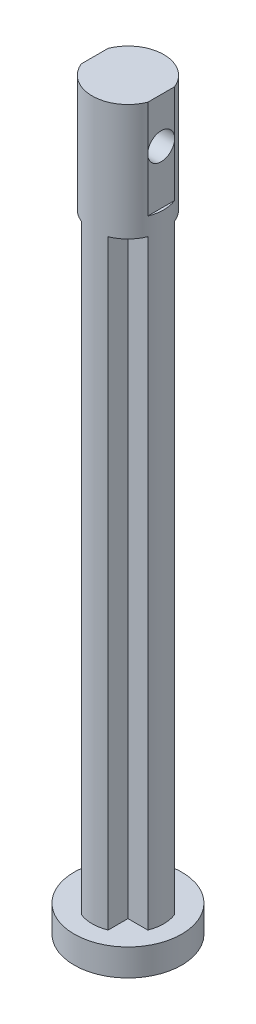
ISO-10303-21;
HEADER;
FILE_DESCRIPTION(('STEP AP214'),'2;1');
FILE_NAME('part.step','',(''),(''),'','','');
FILE_SCHEMA(('AUTOMOTIVE_DESIGN { 1 0 10303 214 1 1 1 1 }'));
ENDSEC;
DATA;
#1=APPLICATION_CONTEXT('core data for automotive mechanical design processes');
#2=APPLICATION_PROTOCOL_DEFINITION('international standard','automotive_design',2000,#1);
#3=PRODUCT_CONTEXT('',#1,'mechanical');
#4=PRODUCT('Part','Part','',(#3));
#5=PRODUCT_RELATED_PRODUCT_CATEGORY('part','',(#4));
#6=PRODUCT_DEFINITION_FORMATION('','',#4);
#7=PRODUCT_DEFINITION_CONTEXT('part definition',#1,'design');
#8=PRODUCT_DEFINITION('design','',#6,#7);
#9=PRODUCT_DEFINITION_SHAPE('','',#8);
#10=(LENGTH_UNIT() NAMED_UNIT(*) SI_UNIT(.MILLI.,.METRE.));
#11=(NAMED_UNIT(*) PLANE_ANGLE_UNIT() SI_UNIT($,.RADIAN.));
#12=(NAMED_UNIT(*) SI_UNIT($,.STERADIAN.) SOLID_ANGLE_UNIT());
#13=UNCERTAINTY_MEASURE_WITH_UNIT(LENGTH_MEASURE(1.E-05),#10,'distance_accuracy_value','');
#14=(GEOMETRIC_REPRESENTATION_CONTEXT(3) GLOBAL_UNCERTAINTY_ASSIGNED_CONTEXT((#13)) GLOBAL_UNIT_ASSIGNED_CONTEXT((#10,
#11,#12)) REPRESENTATION_CONTEXT('',''));
#15=CARTESIAN_POINT('',(0.,0.,0.));
#16=DIRECTION('',(0.,0.,1.));
#17=DIRECTION('',(1.,0.,0.));
#18=AXIS2_PLACEMENT_3D('',#15,#16,#17);
#19=CARTESIAN_POINT('',(-3.70809924354783,2.,-1.5));
#20=DIRECTION('',(-1.,0.,0.));
#21=DIRECTION('',(0.,0.,1.));
#22=AXIS2_PLACEMENT_3D('',#19,#20,#21);
#23=PLANE('',#22);
#24=DIRECTION('',(0.,1.,0.));
#25=VECTOR('',#24,1.);
#26=CARTESIAN_POINT('',(-3.70809924354783,2.,-1.5));
#27=LINE('',#26,#25);
#28=CARTESIAN_POINT('',(-3.70809924354783,8.,-1.5));
#29=VERTEX_POINT('',#28);
#30=CARTESIAN_POINT('',(-3.70809924354783,13.,-1.5));
#31=VERTEX_POINT('',#30);
#32=EDGE_CURVE('E177',#29,#31,#27,.T.);
#33=ORIENTED_EDGE('',*,*,#32,.F.);
#34=CARTESIAN_POINT('',(-3.70809924354783,8.,0.));
#35=DIRECTION('',(1.,0.,0.));
#36=DIRECTION('',(0.,0.,-1.));
#37=AXIS2_PLACEMENT_3D('',#34,#35,#36);
#38=CIRCLE('',#37,1.5);
#39=CARTESIAN_POINT('',(-3.70809924354783,8.,1.5));
#40=VERTEX_POINT('',#39);
#41=EDGE_CURVE('E60',#29,#40,#38,.T.);
#42=ORIENTED_EDGE('',*,*,#41,.T.);
#43=DIRECTION('',(0.,1.,0.));
#44=VECTOR('',#43,1.);
#45=CARTESIAN_POINT('',(-3.70809924354783,2.,1.5));
#46=LINE('',#45,#44);
#47=CARTESIAN_POINT('',(-3.70809924354783,13.,1.5));
#48=VERTEX_POINT('',#47);
#49=EDGE_CURVE('E171',#40,#48,#46,.T.);
#50=ORIENTED_EDGE('',*,*,#49,.T.);
#51=DIRECTION('',(0.,0.,1.));
#52=VECTOR('',#51,1.);
#53=CARTESIAN_POINT('',(-3.70809924354783,13.,-1.5));
#54=LINE('',#53,#52);
#55=EDGE_CURVE('E180',#31,#48,#54,.T.);
#56=ORIENTED_EDGE('',*,*,#55,.F.);
#57=EDGE_LOOP('',(#33,#42,#50,#56));
#58=FACE_BOUND('',#57,.T.);
#59=ADVANCED_FACE('F41',(#58),#23,.T.);
#60=CARTESIAN_POINT('',(0.,13.,0.));
#61=DIRECTION('',(0.,1.,0.));
#62=DIRECTION('',(0.,0.,1.));
#63=AXIS2_PLACEMENT_3D('',#60,#61,#62);
#64=PLANE('',#63);
#65=CARTESIAN_POINT('',(0.,13.,0.));
#66=DIRECTION('',(0.,1.,0.));
#67=DIRECTION('',(0.,0.,1.));
#68=AXIS2_PLACEMENT_3D('',#65,#66,#67);
#69=CIRCLE('',#68,4.);
#70=CARTESIAN_POINT('',(3.70809924354783,13.,-1.5));
#71=VERTEX_POINT('',#70);
#72=EDGE_CURVE('E217',#71,#31,#69,.T.);
#73=ORIENTED_EDGE('',*,*,#72,.T.);
#74=ORIENTED_EDGE('',*,*,#55,.T.);
#75=CARTESIAN_POINT('',(3.70809924354783,13.,1.5));
#76=VERTEX_POINT('',#75);
#77=EDGE_CURVE('E183',#48,#76,#69,.T.);
#78=ORIENTED_EDGE('',*,*,#77,.T.);
#79=DIRECTION('',(0.,0.,1.));
#80=VECTOR('',#79,1.);
#81=CARTESIAN_POINT('',(3.70809924354783,13.,-1.5));
#82=LINE('',#81,#80);
#83=EDGE_CURVE('E191',#71,#76,#82,.T.);
#84=ORIENTED_EDGE('',*,*,#83,.F.);
#85=EDGE_LOOP('',(#73,#74,#78,#84));
#86=FACE_BOUND('',#85,.T.);
#87=ADVANCED_FACE('F356',(#86),#64,.T.);
#88=CARTESIAN_POINT('',(0.,-67.,0.));
#89=DIRECTION('',(0.,1.,0.));
#90=DIRECTION('',(0.,0.,1.));
#91=AXIS2_PLACEMENT_3D('',#88,#89,#90);
#92=CYLINDRICAL_SURFACE('',#91,4.);
#93=DIRECTION('',(0.,1.,0.));
#94=VECTOR('',#93,1.);
#95=CARTESIAN_POINT('',(1.50000000000009,-67.,3.70809924354792));
#96=LINE('',#95,#94);
#97=CARTESIAN_POINT('',(1.50000000000009,-67.,3.70809924354792));
#98=VERTEX_POINT('',#97);
#99=CARTESIAN_POINT('',(1.50000000000009,0.,3.70809924354792));
#100=VERTEX_POINT('',#99);
#101=EDGE_CURVE('E49',#98,#100,#96,.T.);
#102=ORIENTED_EDGE('',*,*,#101,.T.);
#103=CARTESIAN_POINT('',(0.,0.,0.));
#104=DIRECTION('',(0.,1.,0.));
#105=DIRECTION('',(0.,0.,1.));
#106=AXIS2_PLACEMENT_3D('',#103,#104,#105);
#107=CIRCLE('',#106,4.);
#108=CARTESIAN_POINT('',(3.70809924354783,0.,1.50000000000001));
#109=VERTEX_POINT('',#108);
#110=EDGE_CURVE('E225',#100,#109,#107,.T.);
#111=ORIENTED_EDGE('',*,*,#110,.T.);
#112=DIRECTION('',(0.,1.,0.));
#113=VECTOR('',#112,1.);
#114=CARTESIAN_POINT('',(3.70809924354783,-67.,1.50000000000001));
#115=LINE('',#114,#113);
#116=CARTESIAN_POINT('',(3.70809924354783,-67.,1.50000000000001));
#117=VERTEX_POINT('',#116);
#118=EDGE_CURVE('E44',#117,#109,#115,.T.);
#119=ORIENTED_EDGE('',*,*,#118,.F.);
#120=CARTESIAN_POINT('',(0.,-67.,0.));
#121=DIRECTION('',(0.,1.,0.));
#122=DIRECTION('',(0.,0.,1.));
#123=AXIS2_PLACEMENT_3D('',#120,#121,#122);
#124=CIRCLE('',#123,4.);
#125=CARTESIAN_POINT('',(3.70809924354784,-67.,-1.49999999999999));
#126=VERTEX_POINT('',#125);
#127=EDGE_CURVE('E229',#117,#126,#124,.T.);
#128=ORIENTED_EDGE('',*,*,#127,.T.);
#129=DIRECTION('',(0.,1.,0.));
#130=VECTOR('',#129,1.);
#131=CARTESIAN_POINT('',(3.70809924354784,-67.,-1.49999999999999));
#132=LINE('',#131,#130);
#133=CARTESIAN_POINT('',(3.70809924354784,0.,-1.49999999999999));
#134=VERTEX_POINT('',#133);
#135=EDGE_CURVE('E286',#126,#134,#132,.T.);
#136=ORIENTED_EDGE('',*,*,#135,.T.);
#137=CARTESIAN_POINT('',(1.5,0.,-3.70809924354783));
#138=VERTEX_POINT('',#137);
#139=EDGE_CURVE('E223',#134,#138,#107,.T.);
#140=ORIENTED_EDGE('',*,*,#139,.T.);
#141=DIRECTION('',(0.,1.,0.));
#142=VECTOR('',#141,1.);
#143=CARTESIAN_POINT('',(1.5,-67.,-3.70809924354783));
#144=LINE('',#143,#142);
#145=CARTESIAN_POINT('',(1.5,-67.,-3.70809924354783));
#146=VERTEX_POINT('',#145);
#147=EDGE_CURVE('E290',#146,#138,#144,.T.);
#148=ORIENTED_EDGE('',*,*,#147,.F.);
#149=CARTESIAN_POINT('',(-1.5,-67.,-3.70809924354783));
#150=VERTEX_POINT('',#149);
#151=EDGE_CURVE('E234',#146,#150,#124,.T.);
#152=ORIENTED_EDGE('',*,*,#151,.T.);
#153=DIRECTION('',(0.,1.,0.));
#154=VECTOR('',#153,1.);
#155=CARTESIAN_POINT('',(-1.5,-67.,-3.70809924354783));
#156=LINE('',#155,#154);
#157=CARTESIAN_POINT('',(-1.5,0.,-3.70809924354783));
#158=VERTEX_POINT('',#157);
#159=EDGE_CURVE('E283',#150,#158,#156,.T.);
#160=ORIENTED_EDGE('',*,*,#159,.T.);
#161=CARTESIAN_POINT('',(-3.70809924354782,0.,-1.50000000000004));
#162=VERTEX_POINT('',#161);
#163=EDGE_CURVE('E319',#158,#162,#107,.T.);
#164=ORIENTED_EDGE('',*,*,#163,.T.);
#165=DIRECTION('',(0.,1.,0.));
#166=VECTOR('',#165,1.);
#167=CARTESIAN_POINT('',(-3.70809924354782,-67.,-1.50000000000004));
#168=LINE('',#167,#166);
#169=CARTESIAN_POINT('',(-3.70809924354782,-67.,-1.50000000000004));
#170=VERTEX_POINT('',#169);
#171=EDGE_CURVE('E282',#170,#162,#168,.T.);
#172=ORIENTED_EDGE('',*,*,#171,.F.);
#173=CARTESIAN_POINT('',(-3.70809924354785,-67.,1.49999999999996));
#174=VERTEX_POINT('',#173);
#175=EDGE_CURVE('E241',#170,#174,#124,.T.);
#176=ORIENTED_EDGE('',*,*,#175,.T.);
#177=DIRECTION('',(0.,1.,0.));
#178=VECTOR('',#177,1.);
#179=CARTESIAN_POINT('',(-3.70809924354785,-67.,1.49999999999996));
#180=LINE('',#179,#178);
#181=CARTESIAN_POINT('',(-3.70809924354785,0.,1.49999999999996));
#182=VERTEX_POINT('',#181);
#183=EDGE_CURVE('E276',#174,#182,#180,.T.);
#184=ORIENTED_EDGE('',*,*,#183,.T.);
#185=CARTESIAN_POINT('',(-1.49999999999991,0.,3.70809924354792));
#186=VERTEX_POINT('',#185);
#187=EDGE_CURVE('E214',#182,#186,#107,.T.);
#188=ORIENTED_EDGE('',*,*,#187,.T.);
#189=DIRECTION('',(0.,1.,0.));
#190=VECTOR('',#189,1.);
#191=CARTESIAN_POINT('',(-1.49999999999991,-67.,3.70809924354792));
#192=LINE('',#191,#190);
#193=CARTESIAN_POINT('',(-1.49999999999991,-67.,3.70809924354792));
#194=VERTEX_POINT('',#193);
#195=EDGE_CURVE('E274',#194,#186,#192,.T.);
#196=ORIENTED_EDGE('',*,*,#195,.F.);
#197=EDGE_CURVE('E233',#194,#98,#124,.T.);
#198=ORIENTED_EDGE('',*,*,#197,.T.);
#199=EDGE_LOOP('',(#102,#111,#119,#128,#136,#140,#148,#152,#160,#164,#172,#176,#184,#188,#196,#198));
#200=FACE_BOUND('',#199,.T.);
#201=CARTESIAN_POINT('',(0.,2.,0.));
#202=DIRECTION('',(0.,-1.,0.));
#203=DIRECTION('',(0.,0.,1.));
#204=AXIS2_PLACEMENT_3D('',#201,#202,#203);
#205=CIRCLE('',#204,4.);
#206=CARTESIAN_POINT('',(-3.70809924354783,2.,1.5));
#207=VERTEX_POINT('',#206);
#208=CARTESIAN_POINT('',(-3.70809924354783,2.,-1.5));
#209=VERTEX_POINT('',#208);
#210=EDGE_CURVE('E567',#207,#209,#205,.T.);
#211=ORIENTED_EDGE('',*,*,#210,.T.);
#212=EDGE_CURVE('E61',#209,#29,#27,.T.);
#213=ORIENTED_EDGE('',*,*,#212,.T.);
#214=ORIENTED_EDGE('',*,*,#32,.T.);
#215=ORIENTED_EDGE('',*,*,#72,.F.);
#216=DIRECTION('',(0.,1.,0.));
#217=VECTOR('',#216,1.);
#218=CARTESIAN_POINT('',(3.70809924354783,2.,-1.5));
#219=LINE('',#218,#217);
#220=CARTESIAN_POINT('',(3.70809924354783,8.,-1.5));
#221=VERTEX_POINT('',#220);
#222=EDGE_CURVE('E203',#221,#71,#219,.T.);
#223=ORIENTED_EDGE('',*,*,#222,.F.);
#224=CARTESIAN_POINT('',(3.70809924354783,2.,-1.5));
#225=VERTEX_POINT('',#224);
#226=EDGE_CURVE('E207',#225,#221,#219,.T.);
#227=ORIENTED_EDGE('',*,*,#226,.F.);
#228=CARTESIAN_POINT('',(0.,2.,0.));
#229=DIRECTION('',(0.,1.,0.));
#230=DIRECTION('',(0.,0.,1.));
#231=AXIS2_PLACEMENT_3D('',#228,#229,#230);
#232=CIRCLE('',#231,4.);
#233=CARTESIAN_POINT('',(3.70809924354783,2.,1.5));
#234=VERTEX_POINT('',#233);
#235=EDGE_CURVE('E197',#234,#225,#232,.T.);
#236=ORIENTED_EDGE('',*,*,#235,.F.);
#237=DIRECTION('',(0.,1.,0.));
#238=VECTOR('',#237,1.);
#239=CARTESIAN_POINT('',(3.70809924354783,2.,1.5));
#240=LINE('',#239,#238);
#241=CARTESIAN_POINT('',(3.70809924354783,8.,1.5));
#242=VERTEX_POINT('',#241);
#243=EDGE_CURVE('E204',#234,#242,#240,.T.);
#244=ORIENTED_EDGE('',*,*,#243,.T.);
#245=EDGE_CURVE('E208',#242,#76,#240,.T.);
#246=ORIENTED_EDGE('',*,*,#245,.T.);
#247=ORIENTED_EDGE('',*,*,#77,.F.);
#248=ORIENTED_EDGE('',*,*,#49,.F.);
#249=EDGE_CURVE('E181',#207,#40,#46,.T.);
#250=ORIENTED_EDGE('',*,*,#249,.F.);
#251=EDGE_LOOP('',(#211,#213,#214,#215,#223,#227,#236,#244,#246,#247,#248,#250));
#252=FACE_BOUND('',#251,.T.);
#253=ADVANCED_FACE('F185',(#200,#252),#92,.T.);
#254=CARTESIAN_POINT('',(3.70809924354783,2.,-1.5));
#255=DIRECTION('',(-1.,0.,0.));
#256=DIRECTION('',(0.,0.,1.));
#257=AXIS2_PLACEMENT_3D('',#254,#255,#256);
#258=PLANE('',#257);
#259=CARTESIAN_POINT('',(3.70809924354783,8.,0.));
#260=DIRECTION('',(1.,0.,0.));
#261=DIRECTION('',(0.,0.,-1.));
#262=AXIS2_PLACEMENT_3D('',#259,#260,#261);
#263=CIRCLE('',#262,1.5);
#264=EDGE_CURVE('E193',#221,#242,#263,.T.);
#265=ORIENTED_EDGE('',*,*,#264,.F.);
#266=ORIENTED_EDGE('',*,*,#222,.T.);
#267=ORIENTED_EDGE('',*,*,#83,.T.);
#268=ORIENTED_EDGE('',*,*,#245,.F.);
#269=EDGE_LOOP('',(#265,#266,#267,#268));
#270=FACE_BOUND('',#269,.T.);
#271=ADVANCED_FACE('F386',(#270),#258,.F.);
#272=CARTESIAN_POINT('',(0.,-67.,1.5));
#273=DIRECTION('',(0.,0.,-1.));
#274=DIRECTION('',(-1.,0.,0.));
#275=AXIS2_PLACEMENT_3D('',#272,#273,#274);
#276=PLANE('',#275);
#277=DIRECTION('',(-1.,0.,0.));
#278=VECTOR('',#277,1.);
#279=CARTESIAN_POINT('',(0.,0.,1.5));
#280=LINE('',#279,#278);
#281=CARTESIAN_POINT('',(1.49999999999999,0.,1.50000000000001));
#282=VERTEX_POINT('',#281);
#283=EDGE_CURVE('E222',#109,#282,#280,.T.);
#284=ORIENTED_EDGE('',*,*,#283,.T.);
#285=DIRECTION('',(0.,1.,0.));
#286=VECTOR('',#285,1.);
#287=CARTESIAN_POINT('',(1.49999999999999,-67.,1.50000000000001));
#288=LINE('',#287,#286);
#289=CARTESIAN_POINT('',(1.49999999999999,-67.,1.50000000000001));
#290=VERTEX_POINT('',#289);
#291=EDGE_CURVE('E11',#290,#282,#288,.T.);
#292=ORIENTED_EDGE('',*,*,#291,.F.);
#293=DIRECTION('',(-1.,0.,0.));
#294=VECTOR('',#293,1.);
#295=CARTESIAN_POINT('',(0.,-67.,1.5));
#296=LINE('',#295,#294);
#297=EDGE_CURVE('E227',#117,#290,#296,.T.);
#298=ORIENTED_EDGE('',*,*,#297,.F.);
#299=ORIENTED_EDGE('',*,*,#118,.T.);
#300=EDGE_LOOP('',(#284,#292,#298,#299));
#301=FACE_BOUND('',#300,.T.);
#302=ADVANCED_FACE('F43',(#301),#276,.F.);
#303=CARTESIAN_POINT('',(1.49999999999993,-67.,0.));
#304=DIRECTION('',(1.,0.,0.));
#305=DIRECTION('',(0.,0.,-1.));
#306=AXIS2_PLACEMENT_3D('',#303,#304,#305);
#307=PLANE('',#306);
#308=DIRECTION('',(0.,0.,-1.));
#309=VECTOR('',#308,1.);
#310=CARTESIAN_POINT('',(1.49999999999993,0.,0.));
#311=LINE('',#310,#309);
#312=EDGE_CURVE('E226',#100,#282,#311,.T.);
#313=ORIENTED_EDGE('',*,*,#312,.F.);
#314=ORIENTED_EDGE('',*,*,#101,.F.);
#315=DIRECTION('',(0.,0.,-1.));
#316=VECTOR('',#315,1.);
#317=CARTESIAN_POINT('',(1.49999999999993,-67.,0.));
#318=LINE('',#317,#316);
#319=EDGE_CURVE('E246',#98,#290,#318,.T.);
#320=ORIENTED_EDGE('',*,*,#319,.T.);
#321=ORIENTED_EDGE('',*,*,#291,.T.);
#322=EDGE_LOOP('',(#313,#314,#320,#321));
#323=FACE_BOUND('',#322,.T.);
#324=ADVANCED_FACE('F306',(#323),#307,.T.);
#325=CARTESIAN_POINT('',(-1.49999999999992,-67.,0.));
#326=DIRECTION('',(1.,0.,0.));
#327=DIRECTION('',(0.,0.,-1.));
#328=AXIS2_PLACEMENT_3D('',#325,#326,#327);
#329=PLANE('',#328);
#330=DIRECTION('',(0.,0.,-1.));
#331=VECTOR('',#330,1.);
#332=CARTESIAN_POINT('',(-1.49999999999992,0.,0.));
#333=LINE('',#332,#331);
#334=CARTESIAN_POINT('',(-1.49999999999992,0.,1.50000000000009));
#335=VERTEX_POINT('',#334);
#336=EDGE_CURVE('E267',#186,#335,#333,.T.);
#337=ORIENTED_EDGE('',*,*,#336,.T.);
#338=DIRECTION('',(0.,1.,0.));
#339=VECTOR('',#338,1.);
#340=CARTESIAN_POINT('',(-1.49999999999992,-67.,1.50000000000009));
#341=LINE('',#340,#339);
#342=CARTESIAN_POINT('',(-1.49999999999992,-67.,1.50000000000009));
#343=VERTEX_POINT('',#342);
#344=EDGE_CURVE('E280',#343,#335,#341,.T.);
#345=ORIENTED_EDGE('',*,*,#344,.F.);
#346=DIRECTION('',(0.,0.,-1.));
#347=VECTOR('',#346,1.);
#348=CARTESIAN_POINT('',(-1.49999999999992,-67.,0.));
#349=LINE('',#348,#347);
#350=EDGE_CURVE('E248',#194,#343,#349,.T.);
#351=ORIENTED_EDGE('',*,*,#350,.F.);
#352=ORIENTED_EDGE('',*,*,#195,.T.);
#353=EDGE_LOOP('',(#337,#345,#351,#352));
#354=FACE_BOUND('',#353,.T.);
#355=ADVANCED_FACE('F333',(#354),#329,.F.);
#356=CARTESIAN_POINT('',(0.,-67.,1.50000000000017));
#357=DIRECTION('',(0.,0.,1.));
#358=DIRECTION('',(1.,0.,0.));
#359=AXIS2_PLACEMENT_3D('',#356,#357,#358);
#360=PLANE('',#359);
#361=DIRECTION('',(1.,0.,0.));
#362=VECTOR('',#361,1.);
#363=CARTESIAN_POINT('',(0.,0.,1.50000000000017));
#364=LINE('',#363,#362);
#365=EDGE_CURVE('E266',#182,#335,#364,.T.);
#366=ORIENTED_EDGE('',*,*,#365,.F.);
#367=ORIENTED_EDGE('',*,*,#183,.F.);
#368=DIRECTION('',(1.,0.,0.));
#369=VECTOR('',#368,1.);
#370=CARTESIAN_POINT('',(0.,-67.,1.50000000000017));
#371=LINE('',#370,#369);
#372=EDGE_CURVE('E243',#174,#343,#371,.T.);
#373=ORIENTED_EDGE('',*,*,#372,.T.);
#374=ORIENTED_EDGE('',*,*,#344,.T.);
#375=EDGE_LOOP('',(#366,#367,#373,#374));
#376=FACE_BOUND('',#375,.T.);
#377=ADVANCED_FACE('F340',(#376),#360,.T.);
#378=CARTESIAN_POINT('',(0.,-67.,-1.49999999999997));
#379=DIRECTION('',(0.,0.,1.));
#380=DIRECTION('',(1.,0.,0.));
#381=AXIS2_PLACEMENT_3D('',#378,#379,#380);
#382=PLANE('',#381);
#383=DIRECTION('',(1.,0.,0.));
#384=VECTOR('',#383,1.);
#385=CARTESIAN_POINT('',(0.,0.,-1.49999999999997));
#386=LINE('',#385,#384);
#387=CARTESIAN_POINT('',(-1.5,0.,-1.5));
#388=VERTEX_POINT('',#387);
#389=EDGE_CURVE('E263',#162,#388,#386,.T.);
#390=ORIENTED_EDGE('',*,*,#389,.T.);
#391=DIRECTION('',(0.,1.,0.));
#392=VECTOR('',#391,1.);
#393=CARTESIAN_POINT('',(-1.5,-67.,-1.5));
#394=LINE('',#393,#392);
#395=CARTESIAN_POINT('',(-1.5,-67.,-1.5));
#396=VERTEX_POINT('',#395);
#397=EDGE_CURVE('E284',#396,#388,#394,.T.);
#398=ORIENTED_EDGE('',*,*,#397,.F.);
#399=DIRECTION('',(1.,0.,0.));
#400=VECTOR('',#399,1.);
#401=CARTESIAN_POINT('',(0.,-67.,-1.49999999999997));
#402=LINE('',#401,#400);
#403=EDGE_CURVE('E245',#170,#396,#402,.T.);
#404=ORIENTED_EDGE('',*,*,#403,.F.);
#405=ORIENTED_EDGE('',*,*,#171,.T.);
#406=EDGE_LOOP('',(#390,#398,#404,#405));
#407=FACE_BOUND('',#406,.T.);
#408=ADVANCED_FACE('F349',(#407),#382,.F.);
#409=CARTESIAN_POINT('',(-1.5,-67.,0.));
#410=DIRECTION('',(-1.,0.,0.));
#411=DIRECTION('',(0.,0.,1.));
#412=AXIS2_PLACEMENT_3D('',#409,#410,#411);
#413=PLANE('',#412);
#414=DIRECTION('',(0.,0.,1.));
#415=VECTOR('',#414,1.);
#416=CARTESIAN_POINT('',(-1.5,0.,0.));
#417=LINE('',#416,#415);
#418=EDGE_CURVE('E257',#158,#388,#417,.T.);
#419=ORIENTED_EDGE('',*,*,#418,.F.);
#420=ORIENTED_EDGE('',*,*,#159,.F.);
#421=DIRECTION('',(0.,0.,1.));
#422=VECTOR('',#421,1.);
#423=CARTESIAN_POINT('',(-1.5,-67.,0.));
#424=LINE('',#423,#422);
#425=EDGE_CURVE('E239',#150,#396,#424,.T.);
#426=ORIENTED_EDGE('',*,*,#425,.T.);
#427=ORIENTED_EDGE('',*,*,#397,.T.);
#428=EDGE_LOOP('',(#419,#420,#426,#427));
#429=FACE_BOUND('',#428,.T.);
#430=ADVANCED_FACE('F344',(#429),#413,.T.);
#431=CARTESIAN_POINT('',(1.5,-67.,0.));
#432=DIRECTION('',(-1.,0.,0.));
#433=DIRECTION('',(0.,0.,1.));
#434=AXIS2_PLACEMENT_3D('',#431,#432,#433);
#435=PLANE('',#434);
#436=DIRECTION('',(0.,0.,1.));
#437=VECTOR('',#436,1.);
#438=CARTESIAN_POINT('',(1.5,0.,0.));
#439=LINE('',#438,#437);
#440=CARTESIAN_POINT('',(1.5,0.,-1.5));
#441=VERTEX_POINT('',#440);
#442=EDGE_CURVE('E260',#138,#441,#439,.T.);
#443=ORIENTED_EDGE('',*,*,#442,.T.);
#444=DIRECTION('',(0.,1.,0.));
#445=VECTOR('',#444,1.);
#446=CARTESIAN_POINT('',(1.5,-67.,-1.5));
#447=LINE('',#446,#445);
#448=CARTESIAN_POINT('',(1.5,-67.,-1.5));
#449=VERTEX_POINT('',#448);
#450=EDGE_CURVE('E289',#449,#441,#447,.T.);
#451=ORIENTED_EDGE('',*,*,#450,.F.);
#452=DIRECTION('',(0.,0.,1.));
#453=VECTOR('',#452,1.);
#454=CARTESIAN_POINT('',(1.5,-67.,0.));
#455=LINE('',#454,#453);
#456=EDGE_CURVE('E240',#146,#449,#455,.T.);
#457=ORIENTED_EDGE('',*,*,#456,.F.);
#458=ORIENTED_EDGE('',*,*,#147,.T.);
#459=EDGE_LOOP('',(#443,#451,#457,#458));
#460=FACE_BOUND('',#459,.T.);
#461=ADVANCED_FACE('F357',(#460),#435,.F.);
#462=CARTESIAN_POINT('',(0.,-67.,-1.50000000000001));
#463=DIRECTION('',(0.,0.,-1.));
#464=DIRECTION('',(-1.,0.,0.));
#465=AXIS2_PLACEMENT_3D('',#462,#463,#464);
#466=PLANE('',#465);
#467=DIRECTION('',(-1.,0.,0.));
#468=VECTOR('',#467,1.);
#469=CARTESIAN_POINT('',(0.,0.,-1.50000000000001));
#470=LINE('',#469,#468);
#471=EDGE_CURVE('E255',#134,#441,#470,.T.);
#472=ORIENTED_EDGE('',*,*,#471,.F.);
#473=ORIENTED_EDGE('',*,*,#135,.F.);
#474=DIRECTION('',(-1.,0.,0.));
#475=VECTOR('',#474,1.);
#476=CARTESIAN_POINT('',(0.,-67.,-1.50000000000001));
#477=LINE('',#476,#475);
#478=EDGE_CURVE('E235',#126,#449,#477,.T.);
#479=ORIENTED_EDGE('',*,*,#478,.T.);
#480=ORIENTED_EDGE('',*,*,#450,.T.);
#481=EDGE_LOOP('',(#472,#473,#479,#480));
#482=FACE_BOUND('',#481,.T.);
#483=ADVANCED_FACE('F314',(#482),#466,.T.);
#484=CARTESIAN_POINT('',(0.,0.,0.));
#485=DIRECTION('',(0.,1.,0.));
#486=DIRECTION('',(0.,0.,1.));
#487=AXIS2_PLACEMENT_3D('',#484,#485,#486);
#488=PLANE('',#487);
#489=ORIENTED_EDGE('',*,*,#139,.F.);
#490=ORIENTED_EDGE('',*,*,#471,.T.);
#491=ORIENTED_EDGE('',*,*,#442,.F.);
#492=EDGE_LOOP('',(#489,#490,#491));
#493=FACE_BOUND('',#492,.T.);
#494=ADVANCED_FACE('F318',(#493),#488,.F.);
#495=ORIENTED_EDGE('',*,*,#163,.F.);
#496=ORIENTED_EDGE('',*,*,#418,.T.);
#497=ORIENTED_EDGE('',*,*,#389,.F.);
#498=EDGE_LOOP('',(#495,#496,#497));
#499=FACE_BOUND('',#498,.T.);
#500=ADVANCED_FACE('F350',(#499),#488,.F.);
#501=ORIENTED_EDGE('',*,*,#187,.F.);
#502=ORIENTED_EDGE('',*,*,#365,.T.);
#503=ORIENTED_EDGE('',*,*,#336,.F.);
#504=EDGE_LOOP('',(#501,#502,#503));
#505=FACE_BOUND('',#504,.T.);
#506=ADVANCED_FACE('F335',(#505),#488,.F.);
#507=ORIENTED_EDGE('',*,*,#283,.F.);
#508=ORIENTED_EDGE('',*,*,#110,.F.);
#509=ORIENTED_EDGE('',*,*,#312,.T.);
#510=EDGE_LOOP('',(#507,#508,#509));
#511=FACE_BOUND('',#510,.T.);
#512=ADVANCED_FACE('F305',(#511),#488,.F.);
#513=CARTESIAN_POINT('',(0.,-67.,0.));
#514=DIRECTION('',(0.,1.,0.));
#515=DIRECTION('',(0.,0.,1.));
#516=AXIS2_PLACEMENT_3D('',#513,#514,#515);
#517=PLANE('',#516);
#518=CARTESIAN_POINT('',(0.,-67.,0.));
#519=DIRECTION('',(0.,1.,0.));
#520=DIRECTION('',(0.,0.,1.));
#521=AXIS2_PLACEMENT_3D('',#518,#519,#520);
#522=CIRCLE('',#521,6.);
#523=CARTESIAN_POINT('',(0.,-67.,6.));
#524=VERTEX_POINT('',#523);
#525=EDGE_CURVE('E210',#524,#524,#522,.T.);
#526=ORIENTED_EDGE('',*,*,#525,.T.);
#527=EDGE_LOOP('',(#526));
#528=FACE_BOUND('',#527,.T.);
#529=ORIENTED_EDGE('',*,*,#127,.F.);
#530=ORIENTED_EDGE('',*,*,#297,.T.);
#531=ORIENTED_EDGE('',*,*,#319,.F.);
#532=ORIENTED_EDGE('',*,*,#197,.F.);
#533=ORIENTED_EDGE('',*,*,#350,.T.);
#534=ORIENTED_EDGE('',*,*,#372,.F.);
#535=ORIENTED_EDGE('',*,*,#175,.F.);
#536=ORIENTED_EDGE('',*,*,#403,.T.);
#537=ORIENTED_EDGE('',*,*,#425,.F.);
#538=ORIENTED_EDGE('',*,*,#151,.F.);
#539=ORIENTED_EDGE('',*,*,#456,.T.);
#540=ORIENTED_EDGE('',*,*,#478,.F.);
#541=EDGE_LOOP('',(#529,#530,#531,#532,#533,#534,#535,#536,#537,#538,#539,#540));
#542=FACE_BOUND('',#541,.T.);
#543=ADVANCED_FACE('F309',(#528,#542),#517,.T.);
#544=CARTESIAN_POINT('',(0.,-70.,0.));
#545=DIRECTION('',(0.,1.,0.));
#546=DIRECTION('',(0.,0.,1.));
#547=AXIS2_PLACEMENT_3D('',#544,#545,#546);
#548=CYLINDRICAL_SURFACE('',#547,6.);
#549=CARTESIAN_POINT('',(0.,-70.,0.));
#550=DIRECTION('',(0.,1.,0.));
#551=DIRECTION('',(0.,0.,1.));
#552=AXIS2_PLACEMENT_3D('',#549,#550,#551);
#553=CIRCLE('',#552,6.);
#554=CARTESIAN_POINT('',(0.,-70.,6.));
#555=VERTEX_POINT('',#554);
#556=EDGE_CURVE('E215',#555,#555,#553,.T.);
#557=ORIENTED_EDGE('',*,*,#556,.T.);
#558=EDGE_LOOP('',(#557));
#559=FACE_BOUND('',#558,.T.);
#560=ORIENTED_EDGE('',*,*,#525,.F.);
#561=EDGE_LOOP('',(#560));
#562=FACE_BOUND('',#561,.T.);
#563=ADVANCED_FACE('F395',(#559,#562),#548,.T.);
#564=CARTESIAN_POINT('',(0.,-70.,0.));
#565=DIRECTION('',(0.,1.,0.));
#566=DIRECTION('',(0.,0.,1.));
#567=AXIS2_PLACEMENT_3D('',#564,#565,#566);
#568=PLANE('',#567);
#569=ORIENTED_EDGE('',*,*,#556,.F.);
#570=EDGE_LOOP('',(#569));
#571=FACE_BOUND('',#570,.T.);
#572=ADVANCED_FACE('F390',(#571),#568,.F.);
#573=EDGE_CURVE('E198',#242,#221,#263,.T.);
#574=ORIENTED_EDGE('',*,*,#573,.F.);
#575=ORIENTED_EDGE('',*,*,#243,.F.);
#576=DIRECTION('',(0.,0.,1.));
#577=VECTOR('',#576,1.);
#578=CARTESIAN_POINT('',(3.70809924354783,2.,-1.5));
#579=LINE('',#578,#577);
#580=EDGE_CURVE('E200',#225,#234,#579,.T.);
#581=ORIENTED_EDGE('',*,*,#580,.F.);
#582=ORIENTED_EDGE('',*,*,#226,.T.);
#583=EDGE_LOOP('',(#574,#575,#581,#582));
#584=FACE_BOUND('',#583,.T.);
#585=ADVANCED_FACE('F385',(#584),#258,.F.);
#586=CARTESIAN_POINT('',(0.,2.,0.));
#587=DIRECTION('',(0.,1.,0.));
#588=DIRECTION('',(0.,0.,1.));
#589=AXIS2_PLACEMENT_3D('',#586,#587,#588);
#590=PLANE('',#589);
#591=ORIENTED_EDGE('',*,*,#235,.T.);
#592=ORIENTED_EDGE('',*,*,#580,.T.);
#593=EDGE_LOOP('',(#591,#592));
#594=FACE_BOUND('',#593,.T.);
#595=ADVANCED_FACE('F380',(#594),#590,.T.);
#596=CARTESIAN_POINT('',(-0.291900756452169,8.,0.));
#597=DIRECTION('',(1.,0.,0.));
#598=DIRECTION('',(0.,0.,-1.));
#599=AXIS2_PLACEMENT_3D('',#596,#597,#598);
#600=CYLINDRICAL_SURFACE('',#599,1.5);
#601=ORIENTED_EDGE('',*,*,#41,.F.);
#602=EDGE_CURVE('E164',#40,#29,#38,.T.);
#603=ORIENTED_EDGE('',*,*,#602,.F.);
#604=EDGE_LOOP('',(#601,#603));
#605=FACE_BOUND('',#604,.T.);
#606=ORIENTED_EDGE('',*,*,#264,.T.);
#607=ORIENTED_EDGE('',*,*,#573,.T.);
#608=EDGE_LOOP('',(#606,#607));
#609=FACE_BOUND('',#608,.T.);
#610=ADVANCED_FACE('F167',(#605,#609),#600,.F.);
#611=ORIENTED_EDGE('',*,*,#249,.T.);
#612=ORIENTED_EDGE('',*,*,#602,.T.);
#613=ORIENTED_EDGE('',*,*,#212,.F.);
#614=DIRECTION('',(0.,0.,1.));
#615=VECTOR('',#614,1.);
#616=CARTESIAN_POINT('',(-3.70809924354783,2.,-1.5));
#617=LINE('',#616,#615);
#618=EDGE_CURVE('E187',#209,#207,#617,.T.);
#619=ORIENTED_EDGE('',*,*,#618,.T.);
#620=EDGE_LOOP('',(#611,#612,#613,#619));
#621=FACE_BOUND('',#620,.T.);
#622=ADVANCED_FACE('F189',(#621),#23,.T.);
#623=CARTESIAN_POINT('',(0.,2.,0.));
#624=DIRECTION('',(0.,1.,0.));
#625=DIRECTION('',(0.,0.,1.));
#626=AXIS2_PLACEMENT_3D('',#623,#624,#625);
#627=PLANE('',#626);
#628=ORIENTED_EDGE('',*,*,#210,.F.);
#629=ORIENTED_EDGE('',*,*,#618,.F.);
#630=EDGE_LOOP('',(#628,#629));
#631=FACE_BOUND('',#630,.T.);
#632=ADVANCED_FACE('F371',(#631),#627,.T.);
#633=CLOSED_SHELL('',(#59,#87,#253,#271,#302,#324,#355,#377,#408,#430,#461,#483,#494,#500,#506,
#512,#543,#563,#572,#585,#595,#610,#622,#632));
#634=MANIFOLD_SOLID_BREP('B2',#633);
#635=ADVANCED_BREP_SHAPE_REPRESENTATION('',(#18,#634),#14);
#636=SHAPE_DEFINITION_REPRESENTATION(#9,#635);
ENDSEC;
END-ISO-10303-21;
